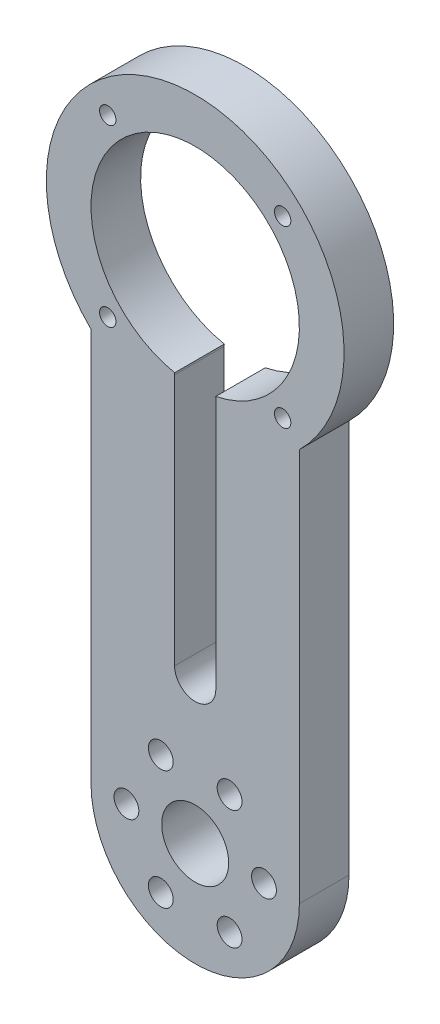
ISO-10303-21;
HEADER;
FILE_DESCRIPTION(('STEP AP214'),'2;1');
FILE_NAME('part.step','',(''),(''),'','','');
FILE_SCHEMA(('AUTOMOTIVE_DESIGN { 1 0 10303 214 1 1 1 1 }'));
ENDSEC;
DATA;
#1=APPLICATION_CONTEXT('core data for automotive mechanical design processes');
#2=APPLICATION_PROTOCOL_DEFINITION('international standard','automotive_design',2000,#1);
#3=PRODUCT_CONTEXT('',#1,'mechanical');
#4=PRODUCT('Part','Part','',(#3));
#5=PRODUCT_RELATED_PRODUCT_CATEGORY('part','',(#4));
#6=PRODUCT_DEFINITION_FORMATION('','',#4);
#7=PRODUCT_DEFINITION_CONTEXT('part definition',#1,'design');
#8=PRODUCT_DEFINITION('design','',#6,#7);
#9=PRODUCT_DEFINITION_SHAPE('','',#8);
#10=(LENGTH_UNIT() NAMED_UNIT(*) SI_UNIT(.MILLI.,.METRE.));
#11=(NAMED_UNIT(*) PLANE_ANGLE_UNIT() SI_UNIT($,.RADIAN.));
#12=(NAMED_UNIT(*) SI_UNIT($,.STERADIAN.) SOLID_ANGLE_UNIT());
#13=UNCERTAINTY_MEASURE_WITH_UNIT(LENGTH_MEASURE(1.E-05),#10,'distance_accuracy_value','');
#14=(GEOMETRIC_REPRESENTATION_CONTEXT(3) GLOBAL_UNCERTAINTY_ASSIGNED_CONTEXT((#13)) GLOBAL_UNIT_ASSIGNED_CONTEXT((#10,
#11,#12)) REPRESENTATION_CONTEXT('',''));
#15=CARTESIAN_POINT('',(0.,0.,0.));
#16=DIRECTION('',(0.,0.,1.));
#17=DIRECTION('',(1.,0.,0.));
#18=AXIS2_PLACEMENT_3D('',#15,#16,#17);
#19=CARTESIAN_POINT('',(-0.772803143949785,46.7519215493666,10.));
#20=DIRECTION('',(0.,0.,1.));
#21=DIRECTION('',(1.,0.,0.));
#22=AXIS2_PLACEMENT_3D('',#19,#20,#21);
#23=PLANE('',#22);
#24=CARTESIAN_POINT('',(16.8483537328802,29.1307646725367,10.));
#25=DIRECTION('',(0.,0.,1.));
#26=DIRECTION('',(1.,0.,0.));
#27=AXIS2_PLACEMENT_3D('',#24,#25,#26);
#28=CIRCLE('',#27,1.65008079549024);
#29=CARTESIAN_POINT('',(18.4984345283704,29.1307646725367,10.));
#30=VERTEX_POINT('',#29);
#31=EDGE_CURVE('E366',#30,#30,#28,.T.);
#32=ORIENTED_EDGE('',*,*,#31,.F.);
#33=EDGE_LOOP('',(#32));
#34=FACE_BOUND('',#33,.T.);
#35=CARTESIAN_POINT('',(6.15815903148356,-41.9439355802954,10.));
#36=DIRECTION('',(0.,0.,1.));
#37=DIRECTION('',(1.,0.,0.));
#38=AXIS2_PLACEMENT_3D('',#35,#36,#37);
#39=CIRCLE('',#38,2.49999999999999);
#40=CARTESIAN_POINT('',(8.65815903148355,-41.9439355802954,10.));
#41=VERTEX_POINT('',#40);
#42=EDGE_CURVE('E382',#41,#41,#39,.T.);
#43=ORIENTED_EDGE('',*,*,#42,.F.);
#44=EDGE_LOOP('',(#43));
#45=FACE_BOUND('',#44,.T.);
#46=CARTESIAN_POINT('',(-14.6347274948162,-53.9487142134837,10.));
#47=DIRECTION('',(0.,0.,1.));
#48=DIRECTION('',(1.,0.,0.));
#49=AXIS2_PLACEMENT_3D('',#46,#47,#48);
#50=CIRCLE('',#49,2.5);
#51=CARTESIAN_POINT('',(-12.1347274948162,-53.9487142134837,10.));
#52=VERTEX_POINT('',#51);
#53=EDGE_CURVE('E398',#52,#52,#50,.T.);
#54=ORIENTED_EDGE('',*,*,#53,.F.);
#55=EDGE_LOOP('',(#54));
#56=FACE_BOUND('',#55,.T.);
#57=CARTESIAN_POINT('',(6.15815903148341,-65.9534928466722,10.));
#58=DIRECTION('',(0.,0.,1.));
#59=DIRECTION('',(1.,0.,0.));
#60=AXIS2_PLACEMENT_3D('',#57,#58,#59);
#61=CIRCLE('',#60,2.5);
#62=CARTESIAN_POINT('',(8.65815903148341,-65.9534928466722,10.));
#63=VERTEX_POINT('',#62);
#64=EDGE_CURVE('E414',#63,#63,#61,.T.);
#65=ORIENTED_EDGE('',*,*,#64,.F.);
#66=EDGE_LOOP('',(#65));
#67=FACE_BOUND('',#66,.T.);
#68=CARTESIAN_POINT('',(13.0891212069166,-53.9487142134838,10.));
#69=DIRECTION('',(0.,0.,1.));
#70=DIRECTION('',(1.,0.,0.));
#71=AXIS2_PLACEMENT_3D('',#68,#69,#70);
#72=CIRCLE('',#71,2.5);
#73=CARTESIAN_POINT('',(15.5891212069166,-53.9487142134838,10.));
#74=VERTEX_POINT('',#73);
#75=EDGE_CURVE('E164',#74,#74,#72,.T.);
#76=ORIENTED_EDGE('',*,*,#75,.F.);
#77=EDGE_LOOP('',(#76));
#78=FACE_BOUND('',#77,.T.);
#79=CARTESIAN_POINT('',(-0.772803143949785,46.7519215493666,10.));
#80=DIRECTION('',(0.,0.,1.));
#81=DIRECTION('',(1.,0.,0.));
#82=AXIS2_PLACEMENT_3D('',#79,#80,#81);
#83=CIRCLE('',#82,30.);
#84=CARTESIAN_POINT('',(20.2271968560502,25.3276362637381,10.));
#85=VERTEX_POINT('',#84);
#86=CARTESIAN_POINT('',(-21.7728031439498,25.3276362637381,10.));
#87=VERTEX_POINT('',#86);
#88=EDGE_CURVE('E202',#85,#87,#83,.T.);
#89=ORIENTED_EDGE('',*,*,#88,.T.);
#90=DIRECTION('',(0.,-1.,0.));
#91=VECTOR('',#90,1.);
#92=CARTESIAN_POINT('',(-21.7728031439498,25.3276362637381,10.));
#93=LINE('',#92,#91);
#94=CARTESIAN_POINT('',(-21.7728031439498,-53.9487142134838,10.));
#95=VERTEX_POINT('',#94);
#96=EDGE_CURVE('E206',#87,#95,#93,.T.);
#97=ORIENTED_EDGE('',*,*,#96,.T.);
#98=CARTESIAN_POINT('',(-0.772803143949785,-53.9487142134838,10.));
#99=DIRECTION('',(0.,0.,1.));
#100=DIRECTION('',(1.,0.,0.));
#101=AXIS2_PLACEMENT_3D('',#98,#99,#100);
#102=CIRCLE('',#101,21.);
#103=CARTESIAN_POINT('',(20.2271968560502,-53.9487142134838,10.));
#104=VERTEX_POINT('',#103);
#105=EDGE_CURVE('E210',#95,#104,#102,.T.);
#106=ORIENTED_EDGE('',*,*,#105,.T.);
#107=DIRECTION('',(0.,1.,0.));
#108=VECTOR('',#107,1.);
#109=CARTESIAN_POINT('',(20.2271968560502,25.3276362637381,10.));
#110=LINE('',#109,#108);
#111=EDGE_CURVE('E213',#104,#85,#110,.T.);
#112=ORIENTED_EDGE('',*,*,#111,.T.);
#113=EDGE_LOOP('',(#89,#97,#106,#112));
#114=FACE_BOUND('',#113,.T.);
#115=CARTESIAN_POINT('',(-0.772803143949785,-53.9487142134838,10.));
#116=DIRECTION('',(0.,0.,1.));
#117=DIRECTION('',(1.,0.,0.));
#118=AXIS2_PLACEMENT_3D('',#115,#116,#117);
#119=CIRCLE('',#118,6.75);
#120=CARTESIAN_POINT('',(5.97719685605022,-53.9487142134838,10.));
#121=VERTEX_POINT('',#120);
#122=EDGE_CURVE('E194',#121,#121,#119,.T.);
#123=ORIENTED_EDGE('',*,*,#122,.F.);
#124=EDGE_LOOP('',(#123));
#125=FACE_BOUND('',#124,.T.);
#126=CARTESIAN_POINT('',(-0.772803143949785,46.7519215493666,10.));
#127=DIRECTION('',(0.,0.,1.));
#128=DIRECTION('',(1.,0.,0.));
#129=AXIS2_PLACEMENT_3D('',#126,#127,#128);
#130=CIRCLE('',#129,21.);
#131=CARTESIAN_POINT('',(3.36082109707943,26.1627702644308,10.));
#132=VERTEX_POINT('',#131);
#133=CARTESIAN_POINT('',(-4.906427384979,26.1627702644308,10.));
#134=VERTEX_POINT('',#133);
#135=EDGE_CURVE('E130',#132,#134,#130,.T.);
#136=ORIENTED_EDGE('',*,*,#135,.F.);
#137=CARTESIAN_POINT('',(-0.772803143949785,25.7519215493666,10.));
#138=DIRECTION('',(0.,0.,1.));
#139=DIRECTION('',(1.,0.,0.));
#140=AXIS2_PLACEMENT_3D('',#137,#138,#139);
#141=CIRCLE('',#140,4.15399157831287);
#142=CARTESIAN_POINT('',(3.38118843436308,25.7519215493666,10.));
#143=VERTEX_POINT('',#142);
#144=EDGE_CURVE('E121',#143,#132,#141,.T.);
#145=ORIENTED_EDGE('',*,*,#144,.F.);
#146=DIRECTION('',(0.,1.,0.));
#147=VECTOR('',#146,1.);
#148=CARTESIAN_POINT('',(3.38118843436308,25.7519215493666,10.));
#149=LINE('',#148,#147);
#150=CARTESIAN_POINT('',(3.38118843436308,-25.0076956860267,10.));
#151=VERTEX_POINT('',#150);
#152=EDGE_CURVE('E159',#151,#143,#149,.T.);
#153=ORIENTED_EDGE('',*,*,#152,.F.);
#154=CARTESIAN_POINT('',(-0.772803143949785,-25.0076956860267,10.));
#155=DIRECTION('',(0.,0.,1.));
#156=DIRECTION('',(1.,0.,0.));
#157=AXIS2_PLACEMENT_3D('',#154,#155,#156);
#158=CIRCLE('',#157,4.15399157831287);
#159=CARTESIAN_POINT('',(-4.92679472226265,-25.0076956860267,10.));
#160=VERTEX_POINT('',#159);
#161=EDGE_CURVE('E156',#160,#151,#158,.T.);
#162=ORIENTED_EDGE('',*,*,#161,.F.);
#163=DIRECTION('',(0.,-1.,0.));
#164=VECTOR('',#163,1.);
#165=CARTESIAN_POINT('',(-4.92679472226265,25.7519215493666,10.));
#166=LINE('',#165,#164);
#167=CARTESIAN_POINT('',(-4.92679472226265,25.7519215493666,10.));
#168=VERTEX_POINT('',#167);
#169=EDGE_CURVE('E150',#168,#160,#166,.T.);
#170=ORIENTED_EDGE('',*,*,#169,.F.);
#171=CARTESIAN_POINT('',(-0.772803143949785,25.7519215493666,10.));
#172=DIRECTION('',(0.,0.,1.));
#173=DIRECTION('',(1.,0.,0.));
#174=AXIS2_PLACEMENT_3D('',#171,#172,#173);
#175=CIRCLE('',#174,4.15399157831287);
#176=EDGE_CURVE('E145',#134,#168,#175,.T.);
#177=ORIENTED_EDGE('',*,*,#176,.F.);
#178=EDGE_LOOP('',(#136,#145,#153,#162,#170,#177));
#179=FACE_BOUND('',#178,.T.);
#180=CARTESIAN_POINT('',(-18.3939600207798,64.3730784261966,10.));
#181=DIRECTION('',(0.,0.,1.));
#182=DIRECTION('',(1.,0.,0.));
#183=AXIS2_PLACEMENT_3D('',#180,#181,#182);
#184=CIRCLE('',#183,1.65);
#185=CARTESIAN_POINT('',(-16.7439600207798,64.3730784261966,10.));
#186=VERTEX_POINT('',#185);
#187=EDGE_CURVE('E422',#186,#186,#184,.T.);
#188=ORIENTED_EDGE('',*,*,#187,.F.);
#189=EDGE_LOOP('',(#188));
#190=FACE_BOUND('',#189,.T.);
#191=CARTESIAN_POINT('',(-7.70376531938305,-65.9534928466722,10.));
#192=DIRECTION('',(0.,0.,1.));
#193=DIRECTION('',(1.,0.,0.));
#194=AXIS2_PLACEMENT_3D('',#191,#192,#193);
#195=CIRCLE('',#194,2.50000000000002);
#196=CARTESIAN_POINT('',(-5.20376531938303,-65.9534928466722,10.));
#197=VERTEX_POINT('',#196);
#198=EDGE_CURVE('E406',#197,#197,#195,.T.);
#199=ORIENTED_EDGE('',*,*,#198,.F.);
#200=EDGE_LOOP('',(#199));
#201=FACE_BOUND('',#200,.T.);
#202=CARTESIAN_POINT('',(-7.70376531938288,-41.9439355802953,10.));
#203=DIRECTION('',(0.,0.,1.));
#204=DIRECTION('',(1.,0.,0.));
#205=AXIS2_PLACEMENT_3D('',#202,#203,#204);
#206=CIRCLE('',#205,2.49999999999999);
#207=CARTESIAN_POINT('',(-5.20376531938289,-41.9439355802953,10.));
#208=VERTEX_POINT('',#207);
#209=EDGE_CURVE('E390',#208,#208,#206,.T.);
#210=ORIENTED_EDGE('',*,*,#209,.F.);
#211=EDGE_LOOP('',(#210));
#212=FACE_BOUND('',#211,.T.);
#213=CARTESIAN_POINT('',(-18.3939600207798,29.1307646725367,10.));
#214=DIRECTION('',(0.,0.,1.));
#215=DIRECTION('',(1.,0.,0.));
#216=AXIS2_PLACEMENT_3D('',#213,#214,#215);
#217=CIRCLE('',#216,1.65);
#218=CARTESIAN_POINT('',(-16.7439600207798,29.1307646725367,10.));
#219=VERTEX_POINT('',#218);
#220=EDGE_CURVE('E374',#219,#219,#217,.T.);
#221=ORIENTED_EDGE('',*,*,#220,.F.);
#222=EDGE_LOOP('',(#221));
#223=FACE_BOUND('',#222,.T.);
#224=CARTESIAN_POINT('',(16.8483537328802,64.3730784261966,10.));
#225=DIRECTION('',(0.,0.,1.));
#226=DIRECTION('',(1.,0.,0.));
#227=AXIS2_PLACEMENT_3D('',#224,#225,#226);
#228=CIRCLE('',#227,1.65);
#229=CARTESIAN_POINT('',(18.4983537328802,64.3730784261966,10.));
#230=VERTEX_POINT('',#229);
#231=EDGE_CURVE('E354',#230,#230,#228,.T.);
#232=ORIENTED_EDGE('',*,*,#231,.F.);
#233=EDGE_LOOP('',(#232));
#234=FACE_BOUND('',#233,.T.);
#235=ADVANCED_FACE('F43',(#34,#45,#56,#67,#78,#114,#125,#179,#190,#201,#212,#223,#234),#23,.T.);
#236=CARTESIAN_POINT('',(-0.772803143949785,46.7519215493666,0.));
#237=DIRECTION('',(0.,0.,1.));
#238=DIRECTION('',(1.,0.,0.));
#239=AXIS2_PLACEMENT_3D('',#236,#237,#238);
#240=PLANE('',#239);
#241=CARTESIAN_POINT('',(-0.772803143949785,-53.9487142134838,0.));
#242=DIRECTION('',(0.,0.,1.));
#243=DIRECTION('',(1.,0.,0.));
#244=AXIS2_PLACEMENT_3D('',#241,#242,#243);
#245=CIRCLE('',#244,6.75);
#246=CARTESIAN_POINT('',(5.97719685605022,-53.9487142134838,0.));
#247=VERTEX_POINT('',#246);
#248=EDGE_CURVE('E139',#247,#247,#245,.T.);
#249=ORIENTED_EDGE('',*,*,#248,.T.);
#250=EDGE_LOOP('',(#249));
#251=FACE_BOUND('',#250,.T.);
#252=CARTESIAN_POINT('',(-0.772803143949785,46.7519215493666,0.));
#253=DIRECTION('',(0.,0.,1.));
#254=DIRECTION('',(1.,0.,0.));
#255=AXIS2_PLACEMENT_3D('',#252,#253,#254);
#256=CIRCLE('',#255,30.);
#257=CARTESIAN_POINT('',(20.2271968560502,25.3276362637381,0.));
#258=VERTEX_POINT('',#257);
#259=CARTESIAN_POINT('',(-21.7728031439498,25.3276362637381,0.));
#260=VERTEX_POINT('',#259);
#261=EDGE_CURVE('E198',#258,#260,#256,.T.);
#262=ORIENTED_EDGE('',*,*,#261,.F.);
#263=DIRECTION('',(0.,1.,0.));
#264=VECTOR('',#263,1.);
#265=CARTESIAN_POINT('',(20.2271968560502,25.3276362637381,0.));
#266=LINE('',#265,#264);
#267=CARTESIAN_POINT('',(20.2271968560502,-53.9487142134838,0.));
#268=VERTEX_POINT('',#267);
#269=EDGE_CURVE('E207',#268,#258,#266,.T.);
#270=ORIENTED_EDGE('',*,*,#269,.F.);
#271=CARTESIAN_POINT('',(-0.772803143949785,-53.9487142134838,0.));
#272=DIRECTION('',(0.,0.,1.));
#273=DIRECTION('',(1.,0.,0.));
#274=AXIS2_PLACEMENT_3D('',#271,#272,#273);
#275=CIRCLE('',#274,21.);
#276=CARTESIAN_POINT('',(-21.7728031439498,-53.9487142134838,0.));
#277=VERTEX_POINT('',#276);
#278=EDGE_CURVE('E223',#277,#268,#275,.T.);
#279=ORIENTED_EDGE('',*,*,#278,.F.);
#280=DIRECTION('',(0.,-1.,0.));
#281=VECTOR('',#280,1.);
#282=CARTESIAN_POINT('',(-21.7728031439498,25.3276362637381,0.));
#283=LINE('',#282,#281);
#284=EDGE_CURVE('E220',#260,#277,#283,.T.);
#285=ORIENTED_EDGE('',*,*,#284,.F.);
#286=EDGE_LOOP('',(#262,#270,#279,#285));
#287=FACE_BOUND('',#286,.T.);
#288=CARTESIAN_POINT('',(-0.772803143949785,25.7519215493666,0.));
#289=DIRECTION('',(0.,0.,1.));
#290=DIRECTION('',(1.,0.,0.));
#291=AXIS2_PLACEMENT_3D('',#288,#289,#290);
#292=CIRCLE('',#291,4.15399157831287);
#293=CARTESIAN_POINT('',(3.38118843436308,25.7519215493666,0.));
#294=VERTEX_POINT('',#293);
#295=CARTESIAN_POINT('',(3.36082109707943,26.1627702644308,0.));
#296=VERTEX_POINT('',#295);
#297=EDGE_CURVE('E67',#294,#296,#292,.T.);
#298=ORIENTED_EDGE('',*,*,#297,.T.);
#299=CARTESIAN_POINT('',(-0.772803143949785,46.7519215493666,0.));
#300=DIRECTION('',(0.,0.,1.));
#301=DIRECTION('',(1.,0.,0.));
#302=AXIS2_PLACEMENT_3D('',#299,#300,#301);
#303=CIRCLE('',#302,21.);
#304=CARTESIAN_POINT('',(-4.906427384979,26.1627702644308,0.));
#305=VERTEX_POINT('',#304);
#306=EDGE_CURVE('E137',#296,#305,#303,.T.);
#307=ORIENTED_EDGE('',*,*,#306,.T.);
#308=CARTESIAN_POINT('',(-0.772803143949785,25.7519215493666,0.));
#309=DIRECTION('',(0.,0.,1.));
#310=DIRECTION('',(1.,0.,0.));
#311=AXIS2_PLACEMENT_3D('',#308,#309,#310);
#312=CIRCLE('',#311,4.15399157831287);
#313=CARTESIAN_POINT('',(-4.92679472226265,25.7519215493666,0.));
#314=VERTEX_POINT('',#313);
#315=EDGE_CURVE('E167',#305,#314,#312,.T.);
#316=ORIENTED_EDGE('',*,*,#315,.T.);
#317=DIRECTION('',(0.,-1.,0.));
#318=VECTOR('',#317,1.);
#319=CARTESIAN_POINT('',(-4.92679472226265,25.7519215493666,0.));
#320=LINE('',#319,#318);
#321=CARTESIAN_POINT('',(-4.92679472226265,-25.0076956860267,0.));
#322=VERTEX_POINT('',#321);
#323=EDGE_CURVE('E171',#314,#322,#320,.T.);
#324=ORIENTED_EDGE('',*,*,#323,.T.);
#325=CARTESIAN_POINT('',(-0.772803143949785,-25.0076956860267,0.));
#326=DIRECTION('',(0.,0.,1.));
#327=DIRECTION('',(1.,0.,0.));
#328=AXIS2_PLACEMENT_3D('',#325,#326,#327);
#329=CIRCLE('',#328,4.15399157831287);
#330=CARTESIAN_POINT('',(3.38118843436308,-25.0076956860267,0.));
#331=VERTEX_POINT('',#330);
#332=EDGE_CURVE('E175',#322,#331,#329,.T.);
#333=ORIENTED_EDGE('',*,*,#332,.T.);
#334=DIRECTION('',(0.,1.,0.));
#335=VECTOR('',#334,1.);
#336=CARTESIAN_POINT('',(3.38118843436308,25.7519215493666,0.));
#337=LINE('',#336,#335);
#338=EDGE_CURVE('E131',#331,#294,#337,.T.);
#339=ORIENTED_EDGE('',*,*,#338,.T.);
#340=EDGE_LOOP('',(#298,#307,#316,#324,#333,#339));
#341=FACE_BOUND('',#340,.T.);
#342=CARTESIAN_POINT('',(13.0891212069166,-53.9487142134838,0.));
#343=DIRECTION('',(0.,0.,1.));
#344=DIRECTION('',(1.,0.,0.));
#345=AXIS2_PLACEMENT_3D('',#342,#343,#344);
#346=CIRCLE('',#345,2.5);
#347=CARTESIAN_POINT('',(15.5891212069166,-53.9487142134838,0.));
#348=VERTEX_POINT('',#347);
#349=EDGE_CURVE('E426',#348,#348,#346,.T.);
#350=ORIENTED_EDGE('',*,*,#349,.T.);
#351=EDGE_LOOP('',(#350));
#352=FACE_BOUND('',#351,.T.);
#353=CARTESIAN_POINT('',(-18.3939600207798,64.3730784261966,0.));
#354=DIRECTION('',(0.,0.,1.));
#355=DIRECTION('',(1.,0.,0.));
#356=AXIS2_PLACEMENT_3D('',#353,#354,#355);
#357=CIRCLE('',#356,1.65);
#358=CARTESIAN_POINT('',(-16.7439600207798,64.3730784261966,0.));
#359=VERTEX_POINT('',#358);
#360=EDGE_CURVE('E418',#359,#359,#357,.T.);
#361=ORIENTED_EDGE('',*,*,#360,.T.);
#362=EDGE_LOOP('',(#361));
#363=FACE_BOUND('',#362,.T.);
#364=CARTESIAN_POINT('',(6.15815903148341,-65.9534928466722,0.));
#365=DIRECTION('',(0.,0.,1.));
#366=DIRECTION('',(1.,0.,0.));
#367=AXIS2_PLACEMENT_3D('',#364,#365,#366);
#368=CIRCLE('',#367,2.5);
#369=CARTESIAN_POINT('',(8.65815903148341,-65.9534928466722,0.));
#370=VERTEX_POINT('',#369);
#371=EDGE_CURVE('E410',#370,#370,#368,.T.);
#372=ORIENTED_EDGE('',*,*,#371,.T.);
#373=EDGE_LOOP('',(#372));
#374=FACE_BOUND('',#373,.T.);
#375=CARTESIAN_POINT('',(-7.70376531938305,-65.9534928466722,0.));
#376=DIRECTION('',(0.,0.,1.));
#377=DIRECTION('',(1.,0.,0.));
#378=AXIS2_PLACEMENT_3D('',#375,#376,#377);
#379=CIRCLE('',#378,2.50000000000002);
#380=CARTESIAN_POINT('',(-5.20376531938303,-65.9534928466722,0.));
#381=VERTEX_POINT('',#380);
#382=EDGE_CURVE('E402',#381,#381,#379,.T.);
#383=ORIENTED_EDGE('',*,*,#382,.T.);
#384=EDGE_LOOP('',(#383));
#385=FACE_BOUND('',#384,.T.);
#386=CARTESIAN_POINT('',(-14.6347274948162,-53.9487142134837,0.));
#387=DIRECTION('',(0.,0.,1.));
#388=DIRECTION('',(1.,0.,0.));
#389=AXIS2_PLACEMENT_3D('',#386,#387,#388);
#390=CIRCLE('',#389,2.5);
#391=CARTESIAN_POINT('',(-12.1347274948162,-53.9487142134837,0.));
#392=VERTEX_POINT('',#391);
#393=EDGE_CURVE('E394',#392,#392,#390,.T.);
#394=ORIENTED_EDGE('',*,*,#393,.T.);
#395=EDGE_LOOP('',(#394));
#396=FACE_BOUND('',#395,.T.);
#397=CARTESIAN_POINT('',(-7.70376531938288,-41.9439355802953,0.));
#398=DIRECTION('',(0.,0.,1.));
#399=DIRECTION('',(1.,0.,0.));
#400=AXIS2_PLACEMENT_3D('',#397,#398,#399);
#401=CIRCLE('',#400,2.49999999999999);
#402=CARTESIAN_POINT('',(-5.20376531938289,-41.9439355802953,0.));
#403=VERTEX_POINT('',#402);
#404=EDGE_CURVE('E386',#403,#403,#401,.T.);
#405=ORIENTED_EDGE('',*,*,#404,.T.);
#406=EDGE_LOOP('',(#405));
#407=FACE_BOUND('',#406,.T.);
#408=CARTESIAN_POINT('',(6.15815903148356,-41.9439355802954,0.));
#409=DIRECTION('',(0.,0.,1.));
#410=DIRECTION('',(1.,0.,0.));
#411=AXIS2_PLACEMENT_3D('',#408,#409,#410);
#412=CIRCLE('',#411,2.49999999999999);
#413=CARTESIAN_POINT('',(8.65815903148355,-41.9439355802954,0.));
#414=VERTEX_POINT('',#413);
#415=EDGE_CURVE('E378',#414,#414,#412,.T.);
#416=ORIENTED_EDGE('',*,*,#415,.T.);
#417=EDGE_LOOP('',(#416));
#418=FACE_BOUND('',#417,.T.);
#419=CARTESIAN_POINT('',(-18.3939600207798,29.1307646725367,0.));
#420=DIRECTION('',(0.,0.,1.));
#421=DIRECTION('',(1.,0.,0.));
#422=AXIS2_PLACEMENT_3D('',#419,#420,#421);
#423=CIRCLE('',#422,1.65);
#424=CARTESIAN_POINT('',(-16.7439600207798,29.1307646725367,0.));
#425=VERTEX_POINT('',#424);
#426=EDGE_CURVE('E370',#425,#425,#423,.T.);
#427=ORIENTED_EDGE('',*,*,#426,.T.);
#428=EDGE_LOOP('',(#427));
#429=FACE_BOUND('',#428,.T.);
#430=CARTESIAN_POINT('',(16.8483537328802,29.1307646725367,0.));
#431=DIRECTION('',(0.,0.,1.));
#432=DIRECTION('',(1.,0.,0.));
#433=AXIS2_PLACEMENT_3D('',#430,#431,#432);
#434=CIRCLE('',#433,1.65008079549024);
#435=CARTESIAN_POINT('',(18.4984345283704,29.1307646725367,0.));
#436=VERTEX_POINT('',#435);
#437=EDGE_CURVE('E363',#436,#436,#434,.T.);
#438=ORIENTED_EDGE('',*,*,#437,.T.);
#439=EDGE_LOOP('',(#438));
#440=FACE_BOUND('',#439,.T.);
#441=CARTESIAN_POINT('',(16.8483537328802,64.3730784261966,0.));
#442=DIRECTION('',(0.,0.,1.));
#443=DIRECTION('',(1.,0.,0.));
#444=AXIS2_PLACEMENT_3D('',#441,#442,#443);
#445=CIRCLE('',#444,1.65);
#446=CARTESIAN_POINT('',(18.4983537328802,64.3730784261966,0.));
#447=VERTEX_POINT('',#446);
#448=EDGE_CURVE('E357',#447,#447,#445,.T.);
#449=ORIENTED_EDGE('',*,*,#448,.T.);
#450=EDGE_LOOP('',(#449));
#451=FACE_BOUND('',#450,.T.);
#452=ADVANCED_FACE('F247',(#251,#287,#341,#352,#363,#374,#385,#396,#407,#418,#429,#440,#451),
#240,.F.);
#453=CARTESIAN_POINT('',(-0.772803143949785,46.7519215493666,10.));
#454=DIRECTION('',(0.,0.,-1.));
#455=DIRECTION('',(-1.,0.,0.));
#456=AXIS2_PLACEMENT_3D('',#453,#454,#455);
#457=CYLINDRICAL_SURFACE('',#456,30.);
#458=ORIENTED_EDGE('',*,*,#261,.T.);
#459=DIRECTION('',(0.,0.,-1.));
#460=VECTOR('',#459,1.);
#461=CARTESIAN_POINT('',(-21.7728031439498,25.3276362637381,10.));
#462=LINE('',#461,#460);
#463=EDGE_CURVE('E11',#87,#260,#462,.T.);
#464=ORIENTED_EDGE('',*,*,#463,.F.);
#465=ORIENTED_EDGE('',*,*,#88,.F.);
#466=DIRECTION('',(0.,0.,-1.));
#467=VECTOR('',#466,1.);
#468=CARTESIAN_POINT('',(20.2271968560502,25.3276362637381,10.));
#469=LINE('',#468,#467);
#470=EDGE_CURVE('E216',#85,#258,#469,.T.);
#471=ORIENTED_EDGE('',*,*,#470,.T.);
#472=EDGE_LOOP('',(#458,#464,#465,#471));
#473=FACE_BOUND('',#472,.T.);
#474=ADVANCED_FACE('F45',(#473),#457,.T.);
#475=CARTESIAN_POINT('',(-21.7728031439498,25.3276362637381,10.));
#476=DIRECTION('',(1.,0.,0.));
#477=DIRECTION('',(0.,1.,0.));
#478=AXIS2_PLACEMENT_3D('',#475,#476,#477);
#479=PLANE('',#478);
#480=ORIENTED_EDGE('',*,*,#284,.T.);
#481=DIRECTION('',(0.,0.,-1.));
#482=VECTOR('',#481,1.);
#483=CARTESIAN_POINT('',(-21.7728031439498,-53.9487142134838,10.));
#484=LINE('',#483,#482);
#485=EDGE_CURVE('E52',#95,#277,#484,.T.);
#486=ORIENTED_EDGE('',*,*,#485,.F.);
#487=ORIENTED_EDGE('',*,*,#96,.F.);
#488=ORIENTED_EDGE('',*,*,#463,.T.);
#489=EDGE_LOOP('',(#480,#486,#487,#488));
#490=FACE_BOUND('',#489,.T.);
#491=ADVANCED_FACE('F258',(#490),#479,.F.);
#492=CARTESIAN_POINT('',(-0.772803143949785,-53.9487142134838,10.));
#493=DIRECTION('',(0.,0.,-1.));
#494=DIRECTION('',(-1.,0.,0.));
#495=AXIS2_PLACEMENT_3D('',#492,#493,#494);
#496=CYLINDRICAL_SURFACE('',#495,21.);
#497=ORIENTED_EDGE('',*,*,#278,.T.);
#498=DIRECTION('',(0.,0.,-1.));
#499=VECTOR('',#498,1.);
#500=CARTESIAN_POINT('',(20.2271968560502,-53.9487142134838,10.));
#501=LINE('',#500,#499);
#502=EDGE_CURVE('E231',#104,#268,#501,.T.);
#503=ORIENTED_EDGE('',*,*,#502,.F.);
#504=ORIENTED_EDGE('',*,*,#105,.F.);
#505=ORIENTED_EDGE('',*,*,#485,.T.);
#506=EDGE_LOOP('',(#497,#503,#504,#505));
#507=FACE_BOUND('',#506,.T.);
#508=ADVANCED_FACE('F241',(#507),#496,.T.);
#509=CARTESIAN_POINT('',(20.2271968560502,25.3276362637381,10.));
#510=DIRECTION('',(-1.,0.,0.));
#511=DIRECTION('',(0.,-1.,0.));
#512=AXIS2_PLACEMENT_3D('',#509,#510,#511);
#513=PLANE('',#512);
#514=ORIENTED_EDGE('',*,*,#269,.T.);
#515=ORIENTED_EDGE('',*,*,#470,.F.);
#516=ORIENTED_EDGE('',*,*,#111,.F.);
#517=ORIENTED_EDGE('',*,*,#502,.T.);
#518=EDGE_LOOP('',(#514,#515,#516,#517));
#519=FACE_BOUND('',#518,.T.);
#520=ADVANCED_FACE('F251',(#519),#513,.F.);
#521=CARTESIAN_POINT('',(-0.772803143949785,-53.9487142134838,10.));
#522=DIRECTION('',(0.,0.,-1.));
#523=DIRECTION('',(-1.,0.,0.));
#524=AXIS2_PLACEMENT_3D('',#521,#522,#523);
#525=CYLINDRICAL_SURFACE('',#524,6.75);
#526=ORIENTED_EDGE('',*,*,#122,.T.);
#527=EDGE_LOOP('',(#526));
#528=FACE_BOUND('',#527,.T.);
#529=ORIENTED_EDGE('',*,*,#248,.F.);
#530=EDGE_LOOP('',(#529));
#531=FACE_BOUND('',#530,.T.);
#532=ADVANCED_FACE('F276',(#528,#531),#525,.F.);
#533=CARTESIAN_POINT('',(-0.772803143949785,25.7519215493666,10.));
#534=DIRECTION('',(0.,0.,-1.));
#535=DIRECTION('',(-1.,0.,0.));
#536=AXIS2_PLACEMENT_3D('',#533,#534,#535);
#537=CYLINDRICAL_SURFACE('',#536,4.15399157831287);
#538=ORIENTED_EDGE('',*,*,#297,.F.);
#539=DIRECTION('',(0.,0.,-1.));
#540=VECTOR('',#539,1.);
#541=CARTESIAN_POINT('',(3.38118843436308,25.7519215493666,10.));
#542=LINE('',#541,#540);
#543=EDGE_CURVE('E125',#143,#294,#542,.T.);
#544=ORIENTED_EDGE('',*,*,#543,.F.);
#545=ORIENTED_EDGE('',*,*,#144,.T.);
#546=DIRECTION('',(0.,0.,-1.));
#547=VECTOR('',#546,1.);
#548=CARTESIAN_POINT('',(3.36082109707943,26.1627702644308,10.));
#549=LINE('',#548,#547);
#550=EDGE_CURVE('E124',#132,#296,#549,.T.);
#551=ORIENTED_EDGE('',*,*,#550,.T.);
#552=EDGE_LOOP('',(#538,#544,#545,#551));
#553=FACE_BOUND('',#552,.T.);
#554=ADVANCED_FACE('F123',(#553),#537,.F.);
#555=CARTESIAN_POINT('',(-0.772803143949785,46.7519215493666,10.));
#556=DIRECTION('',(0.,0.,-1.));
#557=DIRECTION('',(-1.,0.,0.));
#558=AXIS2_PLACEMENT_3D('',#555,#556,#557);
#559=CYLINDRICAL_SURFACE('',#558,21.);
#560=ORIENTED_EDGE('',*,*,#306,.F.);
#561=ORIENTED_EDGE('',*,*,#550,.F.);
#562=ORIENTED_EDGE('',*,*,#135,.T.);
#563=DIRECTION('',(0.,0.,-1.));
#564=VECTOR('',#563,1.);
#565=CARTESIAN_POINT('',(-4.906427384979,26.1627702644308,10.));
#566=LINE('',#565,#564);
#567=EDGE_CURVE('E140',#134,#305,#566,.T.);
#568=ORIENTED_EDGE('',*,*,#567,.T.);
#569=EDGE_LOOP('',(#560,#561,#562,#568));
#570=FACE_BOUND('',#569,.T.);
#571=ADVANCED_FACE('F134',(#570),#559,.F.);
#572=CARTESIAN_POINT('',(-0.772803143949785,25.7519215493666,10.));
#573=DIRECTION('',(0.,0.,-1.));
#574=DIRECTION('',(-1.,0.,0.));
#575=AXIS2_PLACEMENT_3D('',#572,#573,#574);
#576=CYLINDRICAL_SURFACE('',#575,4.15399157831287);
#577=ORIENTED_EDGE('',*,*,#315,.F.);
#578=ORIENTED_EDGE('',*,*,#567,.F.);
#579=ORIENTED_EDGE('',*,*,#176,.T.);
#580=DIRECTION('',(0.,0.,-1.));
#581=VECTOR('',#580,1.);
#582=CARTESIAN_POINT('',(-4.92679472226265,25.7519215493666,10.));
#583=LINE('',#582,#581);
#584=EDGE_CURVE('E189',#168,#314,#583,.T.);
#585=ORIENTED_EDGE('',*,*,#584,.T.);
#586=EDGE_LOOP('',(#577,#578,#579,#585));
#587=FACE_BOUND('',#586,.T.);
#588=ADVANCED_FACE('F293',(#587),#576,.F.);
#589=CARTESIAN_POINT('',(-4.92679472226265,25.7519215493666,10.));
#590=DIRECTION('',(1.,0.,0.));
#591=DIRECTION('',(0.,0.,-1.));
#592=AXIS2_PLACEMENT_3D('',#589,#590,#591);
#593=PLANE('',#592);
#594=ORIENTED_EDGE('',*,*,#323,.F.);
#595=ORIENTED_EDGE('',*,*,#584,.F.);
#596=ORIENTED_EDGE('',*,*,#169,.T.);
#597=DIRECTION('',(0.,0.,-1.));
#598=VECTOR('',#597,1.);
#599=CARTESIAN_POINT('',(-4.92679472226265,-25.0076956860267,10.));
#600=LINE('',#599,#598);
#601=EDGE_CURVE('E186',#160,#322,#600,.T.);
#602=ORIENTED_EDGE('',*,*,#601,.T.);
#603=EDGE_LOOP('',(#594,#595,#596,#602));
#604=FACE_BOUND('',#603,.T.);
#605=ADVANCED_FACE('F298',(#604),#593,.T.);
#606=CARTESIAN_POINT('',(-0.772803143949785,-25.0076956860267,10.));
#607=DIRECTION('',(0.,0.,-1.));
#608=DIRECTION('',(-1.,0.,0.));
#609=AXIS2_PLACEMENT_3D('',#606,#607,#608);
#610=CYLINDRICAL_SURFACE('',#609,4.15399157831287);
#611=ORIENTED_EDGE('',*,*,#332,.F.);
#612=ORIENTED_EDGE('',*,*,#601,.F.);
#613=ORIENTED_EDGE('',*,*,#161,.T.);
#614=DIRECTION('',(0.,0.,-1.));
#615=VECTOR('',#614,1.);
#616=CARTESIAN_POINT('',(3.38118843436308,-25.0076956860267,10.));
#617=LINE('',#616,#615);
#618=EDGE_CURVE('E59',#151,#331,#617,.T.);
#619=ORIENTED_EDGE('',*,*,#618,.T.);
#620=EDGE_LOOP('',(#611,#612,#613,#619));
#621=FACE_BOUND('',#620,.T.);
#622=ADVANCED_FACE('F302',(#621),#610,.F.);
#623=CARTESIAN_POINT('',(3.38118843436308,25.7519215493666,10.));
#624=DIRECTION('',(-1.,0.,0.));
#625=DIRECTION('',(0.,0.,1.));
#626=AXIS2_PLACEMENT_3D('',#623,#624,#625);
#627=PLANE('',#626);
#628=ORIENTED_EDGE('',*,*,#338,.F.);
#629=ORIENTED_EDGE('',*,*,#618,.F.);
#630=ORIENTED_EDGE('',*,*,#152,.T.);
#631=ORIENTED_EDGE('',*,*,#543,.T.);
#632=EDGE_LOOP('',(#628,#629,#630,#631));
#633=FACE_BOUND('',#632,.T.);
#634=ADVANCED_FACE('F306',(#633),#627,.T.);
#635=CARTESIAN_POINT('',(13.0891212069166,-53.9487142134838,10.));
#636=DIRECTION('',(0.,0.,-1.));
#637=DIRECTION('',(-1.,0.,0.));
#638=AXIS2_PLACEMENT_3D('',#635,#636,#637);
#639=CYLINDRICAL_SURFACE('',#638,2.5);
#640=ORIENTED_EDGE('',*,*,#75,.T.);
#641=EDGE_LOOP('',(#640));
#642=FACE_BOUND('',#641,.T.);
#643=ORIENTED_EDGE('',*,*,#349,.F.);
#644=EDGE_LOOP('',(#643));
#645=FACE_BOUND('',#644,.T.);
#646=ADVANCED_FACE('F310',(#642,#645),#639,.F.);
#647=CARTESIAN_POINT('',(-18.3939600207798,64.3730784261966,10.));
#648=DIRECTION('',(0.,0.,-1.));
#649=DIRECTION('',(-1.,0.,0.));
#650=AXIS2_PLACEMENT_3D('',#647,#648,#649);
#651=CYLINDRICAL_SURFACE('',#650,1.65);
#652=ORIENTED_EDGE('',*,*,#187,.T.);
#653=EDGE_LOOP('',(#652));
#654=FACE_BOUND('',#653,.T.);
#655=ORIENTED_EDGE('',*,*,#360,.F.);
#656=EDGE_LOOP('',(#655));
#657=FACE_BOUND('',#656,.T.);
#658=ADVANCED_FACE('F313',(#654,#657),#651,.F.);
#659=CARTESIAN_POINT('',(6.15815903148341,-65.9534928466722,10.));
#660=DIRECTION('',(0.,0.,-1.));
#661=DIRECTION('',(-1.,0.,0.));
#662=AXIS2_PLACEMENT_3D('',#659,#660,#661);
#663=CYLINDRICAL_SURFACE('',#662,2.5);
#664=ORIENTED_EDGE('',*,*,#64,.T.);
#665=EDGE_LOOP('',(#664));
#666=FACE_BOUND('',#665,.T.);
#667=ORIENTED_EDGE('',*,*,#371,.F.);
#668=EDGE_LOOP('',(#667));
#669=FACE_BOUND('',#668,.T.);
#670=ADVANCED_FACE('F317',(#666,#669),#663,.F.);
#671=CARTESIAN_POINT('',(-7.70376531938305,-65.9534928466722,10.));
#672=DIRECTION('',(0.,0.,-1.));
#673=DIRECTION('',(-1.,0.,0.));
#674=AXIS2_PLACEMENT_3D('',#671,#672,#673);
#675=CYLINDRICAL_SURFACE('',#674,2.50000000000002);
#676=ORIENTED_EDGE('',*,*,#198,.T.);
#677=EDGE_LOOP('',(#676));
#678=FACE_BOUND('',#677,.T.);
#679=ORIENTED_EDGE('',*,*,#382,.F.);
#680=EDGE_LOOP('',(#679));
#681=FACE_BOUND('',#680,.T.);
#682=ADVANCED_FACE('F321',(#678,#681),#675,.F.);
#683=CARTESIAN_POINT('',(-14.6347274948162,-53.9487142134837,10.));
#684=DIRECTION('',(0.,0.,-1.));
#685=DIRECTION('',(-1.,0.,0.));
#686=AXIS2_PLACEMENT_3D('',#683,#684,#685);
#687=CYLINDRICAL_SURFACE('',#686,2.5);
#688=ORIENTED_EDGE('',*,*,#53,.T.);
#689=EDGE_LOOP('',(#688));
#690=FACE_BOUND('',#689,.T.);
#691=ORIENTED_EDGE('',*,*,#393,.F.);
#692=EDGE_LOOP('',(#691));
#693=FACE_BOUND('',#692,.T.);
#694=ADVANCED_FACE('F325',(#690,#693),#687,.F.);
#695=CARTESIAN_POINT('',(-7.70376531938288,-41.9439355802953,10.));
#696=DIRECTION('',(0.,0.,-1.));
#697=DIRECTION('',(-1.,0.,0.));
#698=AXIS2_PLACEMENT_3D('',#695,#696,#697);
#699=CYLINDRICAL_SURFACE('',#698,2.49999999999999);
#700=ORIENTED_EDGE('',*,*,#209,.T.);
#701=EDGE_LOOP('',(#700));
#702=FACE_BOUND('',#701,.T.);
#703=ORIENTED_EDGE('',*,*,#404,.F.);
#704=EDGE_LOOP('',(#703));
#705=FACE_BOUND('',#704,.T.);
#706=ADVANCED_FACE('F329',(#702,#705),#699,.F.);
#707=CARTESIAN_POINT('',(6.15815903148356,-41.9439355802954,10.));
#708=DIRECTION('',(0.,0.,-1.));
#709=DIRECTION('',(-1.,0.,0.));
#710=AXIS2_PLACEMENT_3D('',#707,#708,#709);
#711=CYLINDRICAL_SURFACE('',#710,2.49999999999999);
#712=ORIENTED_EDGE('',*,*,#42,.T.);
#713=EDGE_LOOP('',(#712));
#714=FACE_BOUND('',#713,.T.);
#715=ORIENTED_EDGE('',*,*,#415,.F.);
#716=EDGE_LOOP('',(#715));
#717=FACE_BOUND('',#716,.T.);
#718=ADVANCED_FACE('F333',(#714,#717),#711,.F.);
#719=CARTESIAN_POINT('',(-18.3939600207798,29.1307646725367,10.));
#720=DIRECTION('',(0.,0.,-1.));
#721=DIRECTION('',(-1.,0.,0.));
#722=AXIS2_PLACEMENT_3D('',#719,#720,#721);
#723=CYLINDRICAL_SURFACE('',#722,1.65);
#724=ORIENTED_EDGE('',*,*,#220,.T.);
#725=EDGE_LOOP('',(#724));
#726=FACE_BOUND('',#725,.T.);
#727=ORIENTED_EDGE('',*,*,#426,.F.);
#728=EDGE_LOOP('',(#727));
#729=FACE_BOUND('',#728,.T.);
#730=ADVANCED_FACE('F337',(#726,#729),#723,.F.);
#731=CARTESIAN_POINT('',(16.8483537328802,29.1307646725367,10.));
#732=DIRECTION('',(0.,0.,-1.));
#733=DIRECTION('',(-1.,0.,0.));
#734=AXIS2_PLACEMENT_3D('',#731,#732,#733);
#735=CYLINDRICAL_SURFACE('',#734,1.65008079549024);
#736=ORIENTED_EDGE('',*,*,#31,.T.);
#737=EDGE_LOOP('',(#736));
#738=FACE_BOUND('',#737,.T.);
#739=ORIENTED_EDGE('',*,*,#437,.F.);
#740=EDGE_LOOP('',(#739));
#741=FACE_BOUND('',#740,.T.);
#742=ADVANCED_FACE('F341',(#738,#741),#735,.F.);
#743=CARTESIAN_POINT('',(16.8483537328802,64.3730784261966,10.));
#744=DIRECTION('',(0.,0.,-1.));
#745=DIRECTION('',(-1.,0.,0.));
#746=AXIS2_PLACEMENT_3D('',#743,#744,#745);
#747=CYLINDRICAL_SURFACE('',#746,1.65);
#748=ORIENTED_EDGE('',*,*,#231,.T.);
#749=EDGE_LOOP('',(#748));
#750=FACE_BOUND('',#749,.T.);
#751=ORIENTED_EDGE('',*,*,#448,.F.);
#752=EDGE_LOOP('',(#751));
#753=FACE_BOUND('',#752,.T.);
#754=ADVANCED_FACE('F345',(#750,#753),#747,.F.);
#755=CLOSED_SHELL('',(#235,#452,#474,#491,#508,#520,#532,#554,#571,#588,#605,#622,#634,#646,
#658,#670,#682,#694,#706,#718,#730,#742,#754));
#756=MANIFOLD_SOLID_BREP('B2',#755);
#757=ADVANCED_BREP_SHAPE_REPRESENTATION('',(#18,#756),#14);
#758=SHAPE_DEFINITION_REPRESENTATION(#9,#757);
ENDSEC;
END-ISO-10303-21;
